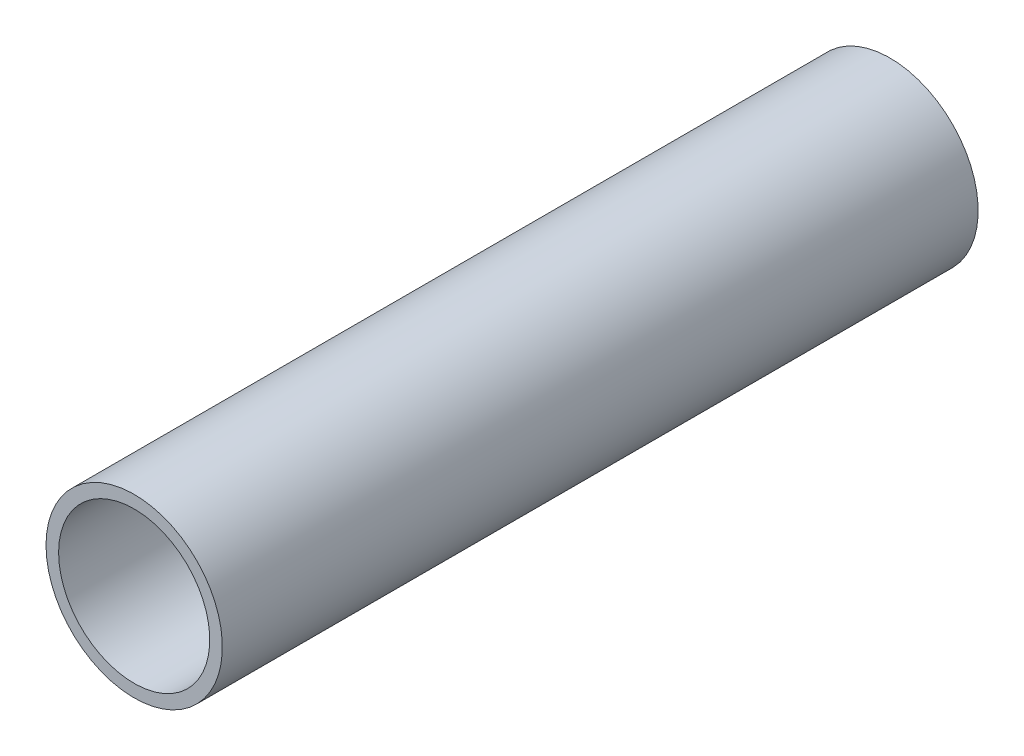
ISO-10303-21;
HEADER;
FILE_DESCRIPTION(('STEP AP214'),'2;1');
FILE_NAME('part.step','',(''),(''),'','','');
FILE_SCHEMA(('AUTOMOTIVE_DESIGN { 1 0 10303 214 1 1 1 1 }'));
ENDSEC;
DATA;
#1=APPLICATION_CONTEXT('core data for automotive mechanical design processes');
#2=APPLICATION_PROTOCOL_DEFINITION('international standard','automotive_design',2000,#1);
#3=PRODUCT_CONTEXT('',#1,'mechanical');
#4=PRODUCT('Part','Part','',(#3));
#5=PRODUCT_RELATED_PRODUCT_CATEGORY('part','',(#4));
#6=PRODUCT_DEFINITION_FORMATION('','',#4);
#7=PRODUCT_DEFINITION_CONTEXT('part definition',#1,'design');
#8=PRODUCT_DEFINITION('design','',#6,#7);
#9=PRODUCT_DEFINITION_SHAPE('','',#8);
#10=(LENGTH_UNIT() NAMED_UNIT(*) SI_UNIT(.MILLI.,.METRE.));
#11=(NAMED_UNIT(*) PLANE_ANGLE_UNIT() SI_UNIT($,.RADIAN.));
#12=(NAMED_UNIT(*) SI_UNIT($,.STERADIAN.) SOLID_ANGLE_UNIT());
#13=UNCERTAINTY_MEASURE_WITH_UNIT(LENGTH_MEASURE(1.E-05),#10,'distance_accuracy_value','');
#14=(GEOMETRIC_REPRESENTATION_CONTEXT(3) GLOBAL_UNCERTAINTY_ASSIGNED_CONTEXT((#13)) GLOBAL_UNIT_ASSIGNED_CONTEXT((#10,
#11,#12)) REPRESENTATION_CONTEXT('',''));
#15=CARTESIAN_POINT('',(0.,0.,0.));
#16=DIRECTION('',(0.,0.,1.));
#17=DIRECTION('',(1.,0.,0.));
#18=AXIS2_PLACEMENT_3D('',#15,#16,#17);
#19=CARTESIAN_POINT('',(0.,0.,60.));
#20=DIRECTION('',(0.,0.,1.));
#21=DIRECTION('',(1.,0.,0.));
#22=AXIS2_PLACEMENT_3D('',#19,#20,#21);
#23=PLANE('',#22);
#24=CARTESIAN_POINT('',(0.,0.,60.));
#25=DIRECTION('',(0.,0.,1.));
#26=DIRECTION('',(1.,0.,0.));
#27=AXIS2_PLACEMENT_3D('',#24,#25,#26);
#28=CIRCLE('',#27,7.);
#29=CARTESIAN_POINT('',(-7.,0.,60.));
#30=VERTEX_POINT('',#29);
#31=EDGE_CURVE('E10',#30,#30,#28,.T.);
#32=ORIENTED_EDGE('',*,*,#31,.T.);
#33=EDGE_LOOP('',(#32));
#34=FACE_BOUND('',#33,.T.);
#35=CARTESIAN_POINT('',(0.,0.,60.));
#36=DIRECTION('',(0.,0.,1.));
#37=DIRECTION('',(1.,0.,0.));
#38=AXIS2_PLACEMENT_3D('',#35,#36,#37);
#39=CIRCLE('',#38,6.);
#40=CARTESIAN_POINT('',(-6.,0.,60.));
#41=VERTEX_POINT('',#40);
#42=EDGE_CURVE('E42',#41,#41,#39,.T.);
#43=ORIENTED_EDGE('',*,*,#42,.F.);
#44=EDGE_LOOP('',(#43));
#45=FACE_BOUND('',#44,.T.);
#46=ADVANCED_FACE('F31',(#34,#45),#23,.T.);
#47=CARTESIAN_POINT('',(0.,0.,0.));
#48=DIRECTION('',(0.,0.,1.));
#49=DIRECTION('',(1.,0.,0.));
#50=AXIS2_PLACEMENT_3D('',#47,#48,#49);
#51=PLANE('',#50);
#52=CARTESIAN_POINT('',(0.,0.,0.));
#53=DIRECTION('',(0.,0.,1.));
#54=DIRECTION('',(1.,0.,0.));
#55=AXIS2_PLACEMENT_3D('',#52,#53,#54);
#56=CIRCLE('',#55,7.);
#57=CARTESIAN_POINT('',(-7.,0.,0.));
#58=VERTEX_POINT('',#57);
#59=EDGE_CURVE('E35',#58,#58,#56,.T.);
#60=ORIENTED_EDGE('',*,*,#59,.F.);
#61=EDGE_LOOP('',(#60));
#62=FACE_BOUND('',#61,.T.);
#63=CARTESIAN_POINT('',(0.,0.,0.));
#64=DIRECTION('',(0.,0.,1.));
#65=DIRECTION('',(1.,0.,0.));
#66=AXIS2_PLACEMENT_3D('',#63,#64,#65);
#67=CIRCLE('',#66,6.);
#68=CARTESIAN_POINT('',(-6.,0.,0.));
#69=VERTEX_POINT('',#68);
#70=EDGE_CURVE('E44',#69,#69,#67,.T.);
#71=ORIENTED_EDGE('',*,*,#70,.T.);
#72=EDGE_LOOP('',(#71));
#73=FACE_BOUND('',#72,.T.);
#74=ADVANCED_FACE('F54',(#62,#73),#51,.F.);
#75=CARTESIAN_POINT('',(0.,0.,60.));
#76=DIRECTION('',(0.,0.,-1.));
#77=DIRECTION('',(-1.,0.,0.));
#78=AXIS2_PLACEMENT_3D('',#75,#76,#77);
#79=CYLINDRICAL_SURFACE('',#78,7.);
#80=CARTESIAN_POINT('',(-7.,0.,60.));
#81=CARTESIAN_POINT('',(-7.,0.,59.375));
#82=CARTESIAN_POINT('',(-7.,0.,58.75));
#83=CARTESIAN_POINT('',(-7.,0.,57.5));
#84=CARTESIAN_POINT('',(-7.,0.,56.875));
#85=CARTESIAN_POINT('',(-7.,0.,55.625));
#86=CARTESIAN_POINT('',(-7.,0.,55.));
#87=CARTESIAN_POINT('',(-7.,0.,53.75));
#88=CARTESIAN_POINT('',(-7.,0.,53.125));
#89=CARTESIAN_POINT('',(-7.,0.,51.875));
#90=CARTESIAN_POINT('',(-7.,0.,51.25));
#91=CARTESIAN_POINT('',(-7.,0.,50.));
#92=CARTESIAN_POINT('',(-7.,0.,49.375));
#93=CARTESIAN_POINT('',(-7.,0.,48.125));
#94=CARTESIAN_POINT('',(-7.,0.,47.5));
#95=CARTESIAN_POINT('',(-7.,0.,46.25));
#96=CARTESIAN_POINT('',(-7.,0.,45.625));
#97=CARTESIAN_POINT('',(-7.,0.,44.375));
#98=CARTESIAN_POINT('',(-7.,0.,43.75));
#99=CARTESIAN_POINT('',(-7.,0.,42.5));
#100=CARTESIAN_POINT('',(-7.,0.,41.875));
#101=CARTESIAN_POINT('',(-7.,0.,40.625));
#102=CARTESIAN_POINT('',(-7.,0.,40.));
#103=CARTESIAN_POINT('',(-7.,0.,38.75));
#104=CARTESIAN_POINT('',(-7.,0.,38.125));
#105=CARTESIAN_POINT('',(-7.,0.,36.875));
#106=CARTESIAN_POINT('',(-7.,0.,36.25));
#107=CARTESIAN_POINT('',(-7.,0.,35.));
#108=CARTESIAN_POINT('',(-7.,0.,34.375));
#109=CARTESIAN_POINT('',(-7.,0.,33.125));
#110=CARTESIAN_POINT('',(-7.,0.,32.5));
#111=CARTESIAN_POINT('',(-7.,0.,31.25));
#112=CARTESIAN_POINT('',(-7.,0.,30.625));
#113=CARTESIAN_POINT('',(-7.,0.,29.375));
#114=CARTESIAN_POINT('',(-7.,0.,28.75));
#115=CARTESIAN_POINT('',(-7.,0.,27.5));
#116=CARTESIAN_POINT('',(-7.,0.,26.875));
#117=CARTESIAN_POINT('',(-7.,0.,25.625));
#118=CARTESIAN_POINT('',(-7.,0.,25.));
#119=CARTESIAN_POINT('',(-7.,0.,23.75));
#120=CARTESIAN_POINT('',(-7.,0.,23.125));
#121=CARTESIAN_POINT('',(-7.,0.,21.875));
#122=CARTESIAN_POINT('',(-7.,0.,21.25));
#123=CARTESIAN_POINT('',(-7.,0.,20.));
#124=CARTESIAN_POINT('',(-7.,0.,19.375));
#125=CARTESIAN_POINT('',(-7.,0.,18.125));
#126=CARTESIAN_POINT('',(-7.,0.,17.5));
#127=CARTESIAN_POINT('',(-7.,0.,16.25));
#128=CARTESIAN_POINT('',(-7.,0.,15.625));
#129=CARTESIAN_POINT('',(-7.,0.,14.375));
#130=CARTESIAN_POINT('',(-7.,0.,13.75));
#131=CARTESIAN_POINT('',(-7.,0.,12.5));
#132=CARTESIAN_POINT('',(-7.,0.,11.875));
#133=CARTESIAN_POINT('',(-7.,0.,10.625));
#134=CARTESIAN_POINT('',(-7.,0.,10.));
#135=CARTESIAN_POINT('',(-7.,0.,8.75));
#136=CARTESIAN_POINT('',(-7.,0.,8.125));
#137=CARTESIAN_POINT('',(-7.,0.,6.875));
#138=CARTESIAN_POINT('',(-7.,0.,6.25));
#139=CARTESIAN_POINT('',(-7.,0.,5.));
#140=CARTESIAN_POINT('',(-7.,0.,4.375));
#141=CARTESIAN_POINT('',(-7.,0.,3.125));
#142=CARTESIAN_POINT('',(-7.,0.,2.5));
#143=CARTESIAN_POINT('',(-7.,0.,1.25));
#144=CARTESIAN_POINT('',(-7.,0.,0.625000000000001));
#145=CARTESIAN_POINT('',(-7.,0.,0.));
#146=B_SPLINE_CURVE_WITH_KNOTS('',3,(#80,#81,#82,#83,#84,#85,#86,#87,#88,#89,#90,#91,#92,#93,
#94,#95,#96,#97,#98,#99,#100,#101,#102,#103,#104,#105,#106,#107,#108,#109,#110,#111,#112,#113,
#114,#115,#116,#117,#118,#119,#120,#121,#122,#123,#124,#125,#126,#127,#128,#129,#130,#131,#132,
#133,#134,#135,#136,#137,#138,#139,#140,#141,#142,#143,#144,#145),.UNSPECIFIED.,.F.,.F.,(4,2,2,
2,2,2,2,2,2,2,2,2,2,2,2,2,2,2,2,2,2,2,2,2,2,2,2,2,2,2,2,2,4),(0.,1.87499999999999,3.75,5.625,
7.49999999999999,9.37499999999999,11.25,13.125,15.,16.875,18.75,20.625,22.5,24.375,26.25,28.125,
30.,31.875,33.75,35.625,37.5,39.375,41.25,43.125,45.,46.875,48.75,50.625,52.5,54.375,56.25,
58.125,60.),.UNSPECIFIED.);
#147=EDGE_CURVE('BSEAM33',#30,#58,#146,.T.);
#148=ORIENTED_EDGE('',*,*,#31,.F.);
#149=ORIENTED_EDGE('',*,*,#59,.T.);
#150=ORIENTED_EDGE('',*,*,#147,.T.);
#151=ORIENTED_EDGE('',*,*,#147,.F.);
#152=EDGE_LOOP('',(#148,#150,#149,#151));
#153=FACE_BOUND('',#152,.T.);
#154=ADVANCED_FACE('F33',(#153),#79,.T.);
#155=CARTESIAN_POINT('',(0.,0.,60.));
#156=DIRECTION('',(0.,0.,-1.));
#157=DIRECTION('',(-1.,0.,0.));
#158=AXIS2_PLACEMENT_3D('',#155,#156,#157);
#159=CYLINDRICAL_SURFACE('',#158,6.);
#160=CARTESIAN_POINT('',(-6.,0.,60.));
#161=CARTESIAN_POINT('',(-6.,0.,59.375));
#162=CARTESIAN_POINT('',(-6.,0.,58.75));
#163=CARTESIAN_POINT('',(-6.,0.,57.5));
#164=CARTESIAN_POINT('',(-6.,0.,56.875));
#165=CARTESIAN_POINT('',(-6.,0.,55.625));
#166=CARTESIAN_POINT('',(-6.,0.,55.));
#167=CARTESIAN_POINT('',(-6.,0.,53.75));
#168=CARTESIAN_POINT('',(-6.,0.,53.125));
#169=CARTESIAN_POINT('',(-6.,0.,51.875));
#170=CARTESIAN_POINT('',(-6.,0.,51.25));
#171=CARTESIAN_POINT('',(-6.,0.,50.));
#172=CARTESIAN_POINT('',(-6.,0.,49.375));
#173=CARTESIAN_POINT('',(-6.,0.,48.125));
#174=CARTESIAN_POINT('',(-6.,0.,47.5));
#175=CARTESIAN_POINT('',(-6.,0.,46.25));
#176=CARTESIAN_POINT('',(-6.,0.,45.625));
#177=CARTESIAN_POINT('',(-6.,0.,44.375));
#178=CARTESIAN_POINT('',(-6.,0.,43.75));
#179=CARTESIAN_POINT('',(-6.,0.,42.5));
#180=CARTESIAN_POINT('',(-6.,0.,41.875));
#181=CARTESIAN_POINT('',(-6.,0.,40.625));
#182=CARTESIAN_POINT('',(-6.,0.,40.));
#183=CARTESIAN_POINT('',(-6.,0.,38.75));
#184=CARTESIAN_POINT('',(-6.,0.,38.125));
#185=CARTESIAN_POINT('',(-6.,0.,36.875));
#186=CARTESIAN_POINT('',(-6.,0.,36.25));
#187=CARTESIAN_POINT('',(-6.,0.,35.));
#188=CARTESIAN_POINT('',(-6.,0.,34.375));
#189=CARTESIAN_POINT('',(-6.,0.,33.125));
#190=CARTESIAN_POINT('',(-6.,0.,32.5));
#191=CARTESIAN_POINT('',(-6.,0.,31.25));
#192=CARTESIAN_POINT('',(-6.,0.,30.625));
#193=CARTESIAN_POINT('',(-6.,0.,29.375));
#194=CARTESIAN_POINT('',(-6.,0.,28.75));
#195=CARTESIAN_POINT('',(-6.,0.,27.5));
#196=CARTESIAN_POINT('',(-6.,0.,26.875));
#197=CARTESIAN_POINT('',(-6.,0.,25.625));
#198=CARTESIAN_POINT('',(-6.,0.,25.));
#199=CARTESIAN_POINT('',(-6.,0.,23.75));
#200=CARTESIAN_POINT('',(-6.,0.,23.125));
#201=CARTESIAN_POINT('',(-6.,0.,21.875));
#202=CARTESIAN_POINT('',(-6.,0.,21.25));
#203=CARTESIAN_POINT('',(-6.,0.,20.));
#204=CARTESIAN_POINT('',(-6.,0.,19.375));
#205=CARTESIAN_POINT('',(-6.,0.,18.125));
#206=CARTESIAN_POINT('',(-6.,0.,17.5));
#207=CARTESIAN_POINT('',(-6.,0.,16.25));
#208=CARTESIAN_POINT('',(-6.,0.,15.625));
#209=CARTESIAN_POINT('',(-6.,0.,14.375));
#210=CARTESIAN_POINT('',(-6.,0.,13.75));
#211=CARTESIAN_POINT('',(-6.,0.,12.5));
#212=CARTESIAN_POINT('',(-6.,0.,11.875));
#213=CARTESIAN_POINT('',(-6.,0.,10.625));
#214=CARTESIAN_POINT('',(-6.,0.,10.));
#215=CARTESIAN_POINT('',(-6.,0.,8.75));
#216=CARTESIAN_POINT('',(-6.,0.,8.125));
#217=CARTESIAN_POINT('',(-6.,0.,6.875));
#218=CARTESIAN_POINT('',(-6.,0.,6.25));
#219=CARTESIAN_POINT('',(-6.,0.,5.));
#220=CARTESIAN_POINT('',(-6.,0.,4.375));
#221=CARTESIAN_POINT('',(-6.,0.,3.125));
#222=CARTESIAN_POINT('',(-6.,0.,2.5));
#223=CARTESIAN_POINT('',(-6.,0.,1.25));
#224=CARTESIAN_POINT('',(-6.,0.,0.625000000000001));
#225=CARTESIAN_POINT('',(-6.,0.,0.));
#226=B_SPLINE_CURVE_WITH_KNOTS('',3,(#160,#161,#162,#163,#164,#165,#166,#167,#168,#169,#170,
#171,#172,#173,#174,#175,#176,#177,#178,#179,#180,#181,#182,#183,#184,#185,#186,#187,#188,#189,
#190,#191,#192,#193,#194,#195,#196,#197,#198,#199,#200,#201,#202,#203,#204,#205,#206,#207,#208,
#209,#210,#211,#212,#213,#214,#215,#216,#217,#218,#219,#220,#221,#222,#223,#224,#225),
.UNSPECIFIED.,.F.,.F.,(4,2,2,2,2,2,2,2,2,2,2,2,2,2,2,2,2,2,2,2,2,2,2,2,2,2,2,2,2,2,2,2,4),(0.,
1.87499999999999,3.75,5.625,7.49999999999999,9.37499999999999,11.25,13.125,15.,16.875,18.75,
20.625,22.5,24.375,26.25,28.125,30.,31.875,33.75,35.625,37.5,39.375,41.25,43.125,45.,46.875,
48.75,50.625,52.5,54.375,56.25,58.125,60.),.UNSPECIFIED.);
#227=EDGE_CURVE('BSEAM50',#41,#69,#226,.T.);
#228=ORIENTED_EDGE('',*,*,#42,.T.);
#229=ORIENTED_EDGE('',*,*,#70,.F.);
#230=ORIENTED_EDGE('',*,*,#227,.T.);
#231=ORIENTED_EDGE('',*,*,#227,.F.);
#232=EDGE_LOOP('',(#228,#230,#229,#231));
#233=FACE_BOUND('',#232,.T.);
#234=ADVANCED_FACE('F50',(#233),#159,.F.);
#235=CLOSED_SHELL('',(#46,#74,#154,#234));
#236=MANIFOLD_SOLID_BREP('B2',#235);
#237=ADVANCED_BREP_SHAPE_REPRESENTATION('',(#18,#236),#14);
#238=SHAPE_DEFINITION_REPRESENTATION(#9,#237);
ENDSEC;
END-ISO-10303-21;
